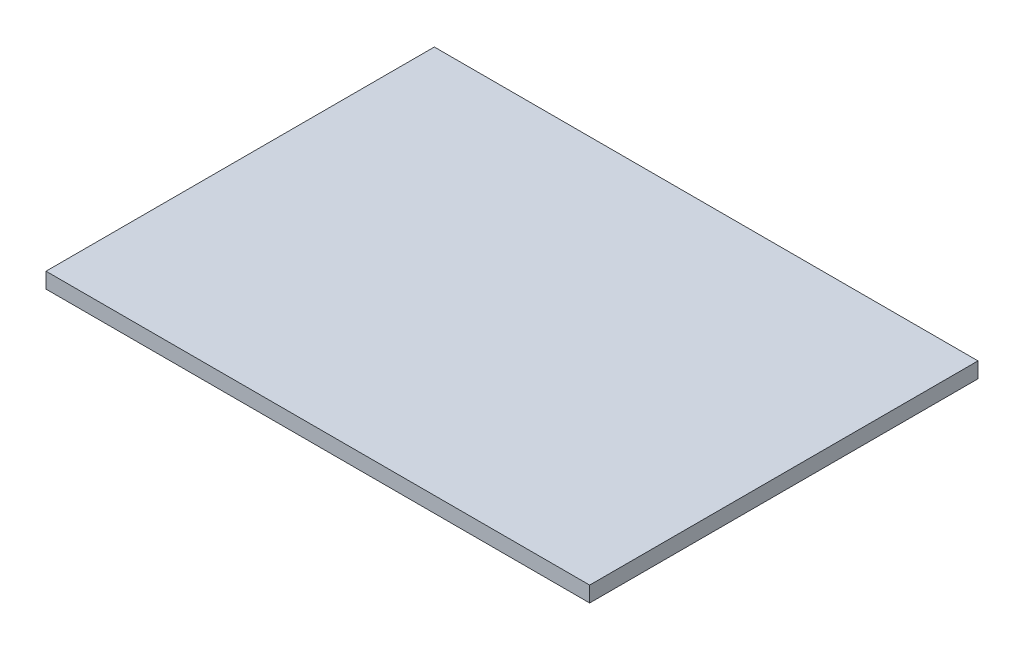
ISO-10303-21;
HEADER;
FILE_DESCRIPTION(('STEP AP214'),'2;1');
FILE_NAME('part.step','',(''),(''),'','','');
FILE_SCHEMA(('AUTOMOTIVE_DESIGN { 1 0 10303 214 1 1 1 1 }'));
ENDSEC;
DATA;
#1=APPLICATION_CONTEXT('core data for automotive mechanical design processes');
#2=APPLICATION_PROTOCOL_DEFINITION('international standard','automotive_design',2000,#1);
#3=PRODUCT_CONTEXT('',#1,'mechanical');
#4=PRODUCT('Part','Part','',(#3));
#5=PRODUCT_RELATED_PRODUCT_CATEGORY('part','',(#4));
#6=PRODUCT_DEFINITION_FORMATION('','',#4);
#7=PRODUCT_DEFINITION_CONTEXT('part definition',#1,'design');
#8=PRODUCT_DEFINITION('design','',#6,#7);
#9=PRODUCT_DEFINITION_SHAPE('','',#8);
#10=(LENGTH_UNIT() NAMED_UNIT(*) SI_UNIT(.MILLI.,.METRE.));
#11=(NAMED_UNIT(*) PLANE_ANGLE_UNIT() SI_UNIT($,.RADIAN.));
#12=(NAMED_UNIT(*) SI_UNIT($,.STERADIAN.) SOLID_ANGLE_UNIT());
#13=UNCERTAINTY_MEASURE_WITH_UNIT(LENGTH_MEASURE(1.E-05),#10,'distance_accuracy_value','');
#14=(GEOMETRIC_REPRESENTATION_CONTEXT(3) GLOBAL_UNCERTAINTY_ASSIGNED_CONTEXT((#13)) GLOBAL_UNIT_ASSIGNED_CONTEXT((#10,
#11,#12)) REPRESENTATION_CONTEXT('',''));
#15=CARTESIAN_POINT('',(0.,0.,0.));
#16=DIRECTION('',(0.,0.,1.));
#17=DIRECTION('',(1.,0.,0.));
#18=AXIS2_PLACEMENT_3D('',#15,#16,#17);
#19=CARTESIAN_POINT('',(0.,2.,0.));
#20=DIRECTION('',(1.,0.,0.));
#21=DIRECTION('',(0.,0.,-1.));
#22=AXIS2_PLACEMENT_3D('',#19,#20,#21);
#23=PLANE('',#22);
#24=DIRECTION('',(0.,0.,1.));
#25=VECTOR('',#24,1.);
#26=CARTESIAN_POINT('',(0.,0.,0.));
#27=LINE('',#26,#25);
#28=CARTESIAN_POINT('',(0.,0.,-50.));
#29=VERTEX_POINT('',#28);
#30=CARTESIAN_POINT('',(0.,0.,0.));
#31=VERTEX_POINT('',#30);
#32=EDGE_CURVE('E97',#29,#31,#27,.T.);
#33=ORIENTED_EDGE('',*,*,#32,.T.);
#34=DIRECTION('',(0.,-1.,0.));
#35=VECTOR('',#34,1.);
#36=CARTESIAN_POINT('',(0.,2.,0.));
#37=LINE('',#36,#35);
#38=CARTESIAN_POINT('',(0.,2.,0.));
#39=VERTEX_POINT('',#38);
#40=EDGE_CURVE('E11',#39,#31,#37,.T.);
#41=ORIENTED_EDGE('',*,*,#40,.F.);
#42=DIRECTION('',(0.,0.,1.));
#43=VECTOR('',#42,1.);
#44=CARTESIAN_POINT('',(0.,2.,0.));
#45=LINE('',#44,#43);
#46=CARTESIAN_POINT('',(0.,2.,-50.));
#47=VERTEX_POINT('',#46);
#48=EDGE_CURVE('E85',#47,#39,#45,.T.);
#49=ORIENTED_EDGE('',*,*,#48,.F.);
#50=DIRECTION('',(0.,-1.,0.));
#51=VECTOR('',#50,1.);
#52=CARTESIAN_POINT('',(0.,2.,-50.));
#53=LINE('',#52,#51);
#54=EDGE_CURVE('E93',#47,#29,#53,.T.);
#55=ORIENTED_EDGE('',*,*,#54,.T.);
#56=EDGE_LOOP('',(#33,#41,#49,#55));
#57=FACE_BOUND('',#56,.T.);
#58=ADVANCED_FACE('F34',(#57),#23,.F.);
#59=CARTESIAN_POINT('',(0.,2.,0.));
#60=DIRECTION('',(0.,0.,-1.));
#61=DIRECTION('',(-1.,0.,0.));
#62=AXIS2_PLACEMENT_3D('',#59,#60,#61);
#63=PLANE('',#62);
#64=DIRECTION('',(1.,0.,0.));
#65=VECTOR('',#64,1.);
#66=CARTESIAN_POINT('',(0.,0.,0.));
#67=LINE('',#66,#65);
#68=CARTESIAN_POINT('',(70.,0.,0.));
#69=VERTEX_POINT('',#68);
#70=EDGE_CURVE('E89',#31,#69,#67,.T.);
#71=ORIENTED_EDGE('',*,*,#70,.T.);
#72=DIRECTION('',(0.,-1.,0.));
#73=VECTOR('',#72,1.);
#74=CARTESIAN_POINT('',(70.,2.,0.));
#75=LINE('',#74,#73);
#76=CARTESIAN_POINT('',(70.,2.,0.));
#77=VERTEX_POINT('',#76);
#78=EDGE_CURVE('E42',#77,#69,#75,.T.);
#79=ORIENTED_EDGE('',*,*,#78,.F.);
#80=DIRECTION('',(1.,0.,0.));
#81=VECTOR('',#80,1.);
#82=CARTESIAN_POINT('',(0.,2.,0.));
#83=LINE('',#82,#81);
#84=EDGE_CURVE('E80',#39,#77,#83,.T.);
#85=ORIENTED_EDGE('',*,*,#84,.F.);
#86=ORIENTED_EDGE('',*,*,#40,.T.);
#87=EDGE_LOOP('',(#71,#79,#85,#86));
#88=FACE_BOUND('',#87,.T.);
#89=ADVANCED_FACE('F88',(#88),#63,.F.);
#90=CARTESIAN_POINT('',(70.,2.,0.));
#91=DIRECTION('',(-1.,0.,0.));
#92=DIRECTION('',(0.,0.,1.));
#93=AXIS2_PLACEMENT_3D('',#90,#91,#92);
#94=PLANE('',#93);
#95=DIRECTION('',(0.,0.,-1.));
#96=VECTOR('',#95,1.);
#97=CARTESIAN_POINT('',(70.,0.,0.));
#98=LINE('',#97,#96);
#99=CARTESIAN_POINT('',(70.,0.,-50.));
#100=VERTEX_POINT('',#99);
#101=EDGE_CURVE('E67',#69,#100,#98,.T.);
#102=ORIENTED_EDGE('',*,*,#101,.T.);
#103=DIRECTION('',(0.,-1.,0.));
#104=VECTOR('',#103,1.);
#105=CARTESIAN_POINT('',(70.,2.,-50.));
#106=LINE('',#105,#104);
#107=CARTESIAN_POINT('',(70.,2.,-50.));
#108=VERTEX_POINT('',#107);
#109=EDGE_CURVE('E90',#108,#100,#106,.T.);
#110=ORIENTED_EDGE('',*,*,#109,.F.);
#111=DIRECTION('',(0.,0.,-1.));
#112=VECTOR('',#111,1.);
#113=CARTESIAN_POINT('',(70.,2.,0.));
#114=LINE('',#113,#112);
#115=EDGE_CURVE('E83',#77,#108,#114,.T.);
#116=ORIENTED_EDGE('',*,*,#115,.F.);
#117=ORIENTED_EDGE('',*,*,#78,.T.);
#118=EDGE_LOOP('',(#102,#110,#116,#117));
#119=FACE_BOUND('',#118,.T.);
#120=ADVANCED_FACE('F91',(#119),#94,.F.);
#121=CARTESIAN_POINT('',(0.,2.,-50.));
#122=DIRECTION('',(0.,0.,1.));
#123=DIRECTION('',(1.,0.,0.));
#124=AXIS2_PLACEMENT_3D('',#121,#122,#123);
#125=PLANE('',#124);
#126=DIRECTION('',(-1.,0.,0.));
#127=VECTOR('',#126,1.);
#128=CARTESIAN_POINT('',(0.,0.,-50.));
#129=LINE('',#128,#127);
#130=EDGE_CURVE('E73',#100,#29,#129,.T.);
#131=ORIENTED_EDGE('',*,*,#130,.T.);
#132=ORIENTED_EDGE('',*,*,#54,.F.);
#133=DIRECTION('',(-1.,0.,0.));
#134=VECTOR('',#133,1.);
#135=CARTESIAN_POINT('',(0.,2.,-50.));
#136=LINE('',#135,#134);
#137=EDGE_CURVE('E50',#108,#47,#136,.T.);
#138=ORIENTED_EDGE('',*,*,#137,.F.);
#139=ORIENTED_EDGE('',*,*,#109,.T.);
#140=EDGE_LOOP('',(#131,#132,#138,#139));
#141=FACE_BOUND('',#140,.T.);
#142=ADVANCED_FACE('F104',(#141),#125,.F.);
#143=CARTESIAN_POINT('',(0.,2.,0.));
#144=DIRECTION('',(0.,-1.,0.));
#145=DIRECTION('',(0.,0.,-1.));
#146=AXIS2_PLACEMENT_3D('',#143,#144,#145);
#147=PLANE('',#146);
#148=ORIENTED_EDGE('',*,*,#48,.T.);
#149=ORIENTED_EDGE('',*,*,#84,.T.);
#150=ORIENTED_EDGE('',*,*,#115,.T.);
#151=ORIENTED_EDGE('',*,*,#137,.T.);
#152=EDGE_LOOP('',(#148,#149,#150,#151));
#153=FACE_BOUND('',#152,.T.);
#154=ADVANCED_FACE('F81',(#153),#147,.F.);
#155=CARTESIAN_POINT('',(0.,0.,0.));
#156=DIRECTION('',(0.,-1.,0.));
#157=DIRECTION('',(0.,0.,-1.));
#158=AXIS2_PLACEMENT_3D('',#155,#156,#157);
#159=PLANE('',#158);
#160=ORIENTED_EDGE('',*,*,#32,.F.);
#161=ORIENTED_EDGE('',*,*,#130,.F.);
#162=ORIENTED_EDGE('',*,*,#101,.F.);
#163=ORIENTED_EDGE('',*,*,#70,.F.);
#164=EDGE_LOOP('',(#160,#161,#162,#163));
#165=FACE_BOUND('',#164,.T.);
#166=ADVANCED_FACE('F107',(#165),#159,.T.);
#167=CLOSED_SHELL('',(#58,#89,#120,#142,#154,#166));
#168=MANIFOLD_SOLID_BREP('B2',#167);
#169=ADVANCED_BREP_SHAPE_REPRESENTATION('',(#18,#168),#14);
#170=SHAPE_DEFINITION_REPRESENTATION(#9,#169);
ENDSEC;
END-ISO-10303-21;
